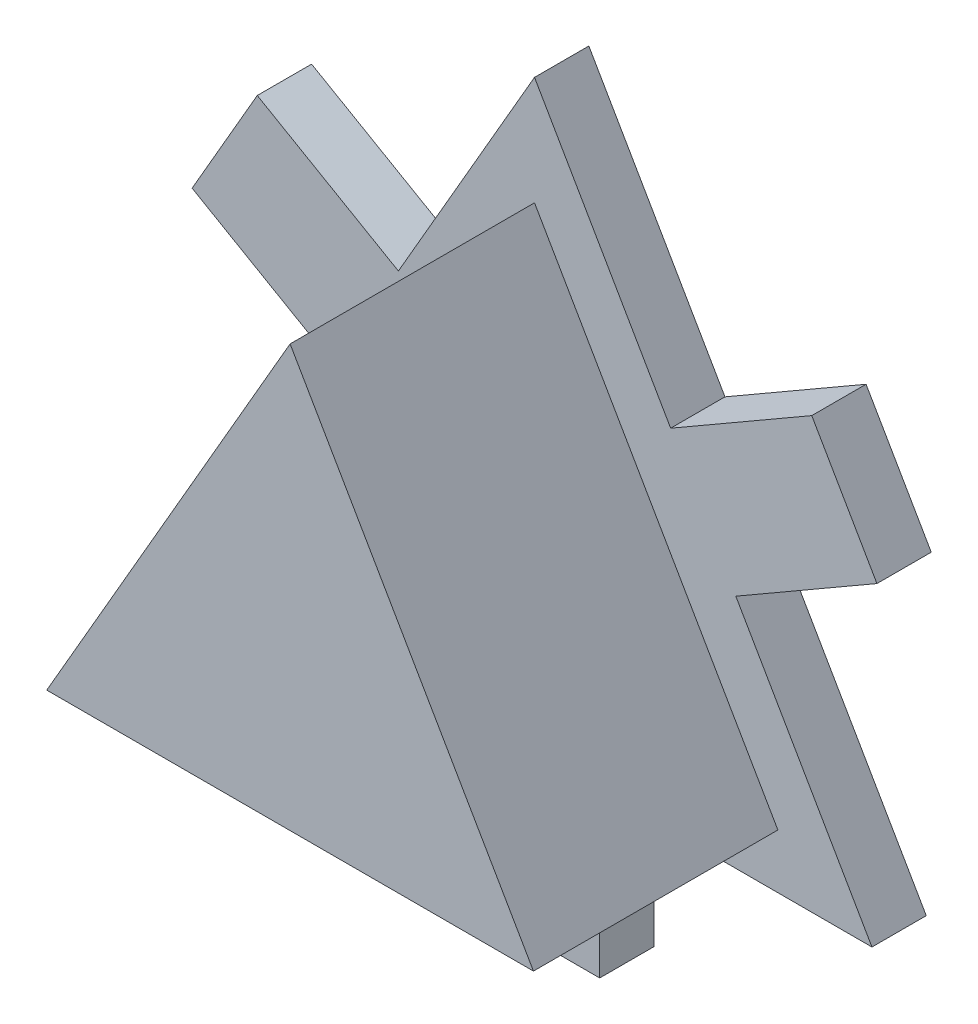
ISO-10303-21;
HEADER;
FILE_DESCRIPTION(('STEP AP214'),'2;1');
FILE_NAME('part.step','',(''),(''),'','','');
FILE_SCHEMA(('AUTOMOTIVE_DESIGN { 1 0 10303 214 1 1 1 1 }'));
ENDSEC;
DATA;
#1=APPLICATION_CONTEXT('core data for automotive mechanical design processes');
#2=APPLICATION_PROTOCOL_DEFINITION('international standard','automotive_design',2000,#1);
#3=PRODUCT_CONTEXT('',#1,'mechanical');
#4=PRODUCT('Part','Part','',(#3));
#5=PRODUCT_RELATED_PRODUCT_CATEGORY('part','',(#4));
#6=PRODUCT_DEFINITION_FORMATION('','',#4);
#7=PRODUCT_DEFINITION_CONTEXT('part definition',#1,'design');
#8=PRODUCT_DEFINITION('design','',#6,#7);
#9=PRODUCT_DEFINITION_SHAPE('','',#8);
#10=(LENGTH_UNIT() NAMED_UNIT(*) SI_UNIT(.MILLI.,.METRE.));
#11=(NAMED_UNIT(*) PLANE_ANGLE_UNIT() SI_UNIT($,.RADIAN.));
#12=(NAMED_UNIT(*) SI_UNIT($,.STERADIAN.) SOLID_ANGLE_UNIT());
#13=UNCERTAINTY_MEASURE_WITH_UNIT(LENGTH_MEASURE(1.E-05),#10,'distance_accuracy_value','');
#14=(GEOMETRIC_REPRESENTATION_CONTEXT(3) GLOBAL_UNCERTAINTY_ASSIGNED_CONTEXT((#13)) GLOBAL_UNIT_ASSIGNED_CONTEXT((#10,
#11,#12)) REPRESENTATION_CONTEXT('',''));
#15=CARTESIAN_POINT('',(0.,0.,0.));
#16=DIRECTION('',(0.,0.,1.));
#17=DIRECTION('',(1.,0.,0.));
#18=AXIS2_PLACEMENT_3D('',#15,#16,#17);
#19=CARTESIAN_POINT('',(8.51321397007544,6.26187833033706,4.5));
#20=DIRECTION('',(0.866025403784439,-0.5,0.));
#21=DIRECTION('',(0.5,0.866025403784439,0.));
#22=AXIS2_PLACEMENT_3D('',#19,#20,#21);
#23=PLANE('',#22);
#24=DIRECTION('',(-0.5,-0.866025403784439,0.));
#25=VECTOR('',#24,1.);
#26=CARTESIAN_POINT('',(8.51321397007544,6.26187833033706,0.));
#27=LINE('',#26,#25);
#28=CARTESIAN_POINT('',(8.51321397007544,6.26187833033706,0.));
#29=VERTEX_POINT('',#28);
#30=CARTESIAN_POINT('',(4.0328292123461,-1.49837570750732,0.));
#31=VERTEX_POINT('',#30);
#32=EDGE_CURVE('E180',#29,#31,#27,.T.);
#33=ORIENTED_EDGE('',*,*,#32,.T.);
#34=DIRECTION('',(0.,0.,-1.));
#35=VECTOR('',#34,1.);
#36=CARTESIAN_POINT('',(4.0328292123461,-1.49837570750732,4.5));
#37=LINE('',#36,#35);
#38=CARTESIAN_POINT('',(4.0328292123461,-1.49837570750732,4.5));
#39=VERTEX_POINT('',#38);
#40=EDGE_CURVE('E11',#39,#31,#37,.T.);
#41=ORIENTED_EDGE('',*,*,#40,.F.);
#42=DIRECTION('',(-0.5,-0.866025403784439,0.));
#43=VECTOR('',#42,1.);
#44=CARTESIAN_POINT('',(8.51321397007544,6.26187833033706,4.5));
#45=LINE('',#44,#43);
#46=CARTESIAN_POINT('',(8.51321397007544,6.26187833033706,4.5));
#47=VERTEX_POINT('',#46);
#48=EDGE_CURVE('E189',#47,#39,#45,.T.);
#49=ORIENTED_EDGE('',*,*,#48,.F.);
#50=DIRECTION('',(0.,0.,-1.));
#51=VECTOR('',#50,1.);
#52=CARTESIAN_POINT('',(8.51321397007544,6.26187833033706,4.5));
#53=LINE('',#52,#51);
#54=EDGE_CURVE('E194',#47,#29,#53,.T.);
#55=ORIENTED_EDGE('',*,*,#54,.T.);
#56=EDGE_LOOP('',(#33,#41,#49,#55));
#57=FACE_BOUND('',#56,.T.);
#58=ADVANCED_FACE('F35',(#57),#23,.F.);
#59=CARTESIAN_POINT('',(4.0328292123461,-1.49837570750732,4.5));
#60=DIRECTION('',(0.,1.,0.));
#61=DIRECTION('',(-1.,0.,0.));
#62=AXIS2_PLACEMENT_3D('',#59,#60,#61);
#63=PLANE('',#62);
#64=DIRECTION('',(1.,0.,0.));
#65=VECTOR('',#64,1.);
#66=CARTESIAN_POINT('',(4.0328292123461,-1.49837570750732,0.));
#67=LINE('',#66,#65);
#68=CARTESIAN_POINT('',(12.9935987278048,-1.49837570750732,0.));
#69=VERTEX_POINT('',#68);
#70=EDGE_CURVE('E183',#31,#69,#67,.T.);
#71=ORIENTED_EDGE('',*,*,#70,.T.);
#72=DIRECTION('',(0.,0.,-1.));
#73=VECTOR('',#72,1.);
#74=CARTESIAN_POINT('',(12.9935987278048,-1.49837570750732,4.5));
#75=LINE('',#74,#73);
#76=CARTESIAN_POINT('',(12.9935987278048,-1.49837570750732,4.5));
#77=VERTEX_POINT('',#76);
#78=EDGE_CURVE('E43',#77,#69,#75,.T.);
#79=ORIENTED_EDGE('',*,*,#78,.F.);
#80=DIRECTION('',(1.,0.,0.));
#81=VECTOR('',#80,1.);
#82=CARTESIAN_POINT('',(4.0328292123461,-1.49837570750732,4.5));
#83=LINE('',#82,#81);
#84=EDGE_CURVE('E191',#39,#77,#83,.T.);
#85=ORIENTED_EDGE('',*,*,#84,.F.);
#86=ORIENTED_EDGE('',*,*,#40,.T.);
#87=EDGE_LOOP('',(#71,#79,#85,#86));
#88=FACE_BOUND('',#87,.T.);
#89=ADVANCED_FACE('F206',(#88),#63,.F.);
#90=CARTESIAN_POINT('',(12.9935987278048,-1.49837570750732,4.5));
#91=DIRECTION('',(-0.866025403784438,-0.5,0.));
#92=DIRECTION('',(0.5,-0.866025403784439,0.));
#93=AXIS2_PLACEMENT_3D('',#90,#91,#92);
#94=PLANE('',#93);
#95=DIRECTION('',(-0.5,0.866025403784439,0.));
#96=VECTOR('',#95,1.);
#97=CARTESIAN_POINT('',(12.9935987278048,-1.49837570750732,0.));
#98=LINE('',#97,#96);
#99=EDGE_CURVE('E192',#69,#29,#98,.T.);
#100=ORIENTED_EDGE('',*,*,#99,.T.);
#101=ORIENTED_EDGE('',*,*,#54,.F.);
#102=DIRECTION('',(-0.5,0.866025403784439,0.));
#103=VECTOR('',#102,1.);
#104=CARTESIAN_POINT('',(12.9935987278048,-1.49837570750732,4.5));
#105=LINE('',#104,#103);
#106=EDGE_CURVE('E50',#77,#47,#105,.T.);
#107=ORIENTED_EDGE('',*,*,#106,.F.);
#108=ORIENTED_EDGE('',*,*,#78,.T.);
#109=EDGE_LOOP('',(#100,#101,#107,#108));
#110=FACE_BOUND('',#109,.T.);
#111=ADVANCED_FACE('F204',(#110),#94,.F.);
#112=CARTESIAN_POINT('',(0.,0.,4.5));
#113=DIRECTION('',(0.,0.,1.));
#114=DIRECTION('',(1.,0.,0.));
#115=AXIS2_PLACEMENT_3D('',#112,#113,#114);
#116=PLANE('',#115);
#117=ORIENTED_EDGE('',*,*,#48,.T.);
#118=ORIENTED_EDGE('',*,*,#84,.T.);
#119=ORIENTED_EDGE('',*,*,#106,.T.);
#120=EDGE_LOOP('',(#117,#118,#119));
#121=FACE_BOUND('',#120,.T.);
#122=ADVANCED_FACE('F213',(#121),#116,.T.);
#123=CARTESIAN_POINT('',(0.,0.,0.));
#124=DIRECTION('',(0.,0.,-1.));
#125=DIRECTION('',(-1.,0.,0.));
#126=AXIS2_PLACEMENT_3D('',#123,#124,#125);
#127=PLANE('',#126);
#128=DIRECTION('',(0.499999999999997,-0.86602540378444,0.));
#129=VECTOR('',#128,1.);
#130=CARTESIAN_POINT('',(13.6175079640779,5.42098179595619,0.));
#131=LINE('',#130,#129);
#132=CARTESIAN_POINT('',(13.6175079640779,5.42098179595619,0.));
#133=VERTEX_POINT('',#132);
#134=CARTESIAN_POINT('',(14.8175079640778,3.34252082687354,0.));
#135=VERTEX_POINT('',#134);
#136=EDGE_CURVE('E179',#133,#135,#131,.T.);
#137=ORIENTED_EDGE('',*,*,#136,.F.);
#138=DIRECTION('',(0.866025403784439,0.5,0.));
#139=VECTOR('',#138,1.);
#140=CARTESIAN_POINT('',(11.0194317527245,3.92098179595619,0.));
#141=LINE('',#140,#139);
#142=CARTESIAN_POINT('',(11.0194317527245,3.92098179595619,0.));
#143=VERTEX_POINT('',#142);
#144=EDGE_CURVE('E175',#143,#133,#141,.T.);
#145=ORIENTED_EDGE('',*,*,#144,.F.);
#146=DIRECTION('',(0.499999999999999,-0.866025403784439,0.));
#147=VECTOR('',#146,1.);
#148=CARTESIAN_POINT('',(8.51321397007544,8.26187833033706,0.));
#149=LINE('',#148,#147);
#150=CARTESIAN_POINT('',(8.51321397007544,8.26187833033706,0.));
#151=VERTEX_POINT('',#150);
#152=EDGE_CURVE('E404',#151,#143,#149,.T.);
#153=ORIENTED_EDGE('',*,*,#152,.F.);
#154=DIRECTION('',(0.5,0.866025403784438,0.));
#155=VECTOR('',#154,1.);
#156=CARTESIAN_POINT('',(6.00699618742632,3.92098179595619,0.));
#157=LINE('',#156,#155);
#158=CARTESIAN_POINT('',(6.00699618742632,3.92098179595619,0.));
#159=VERTEX_POINT('',#158);
#160=EDGE_CURVE('E434',#159,#151,#157,.T.);
#161=ORIENTED_EDGE('',*,*,#160,.F.);
#162=DIRECTION('',(0.866025403784437,-0.500000000000003,0.));
#163=VECTOR('',#162,1.);
#164=CARTESIAN_POINT('',(3.40891997607301,5.4209817959562,0.));
#165=LINE('',#164,#163);
#166=CARTESIAN_POINT('',(3.40891997607301,5.4209817959562,0.));
#167=VERTEX_POINT('',#166);
#168=EDGE_CURVE('E432',#167,#159,#165,.T.);
#169=ORIENTED_EDGE('',*,*,#168,.F.);
#170=DIRECTION('',(0.5,0.866025403784439,0.));
#171=VECTOR('',#170,1.);
#172=CARTESIAN_POINT('',(2.20891997607301,3.34252082687354,0.));
#173=LINE('',#172,#171);
#174=CARTESIAN_POINT('',(2.20891997607301,3.34252082687354,0.));
#175=VERTEX_POINT('',#174);
#176=EDGE_CURVE('E430',#175,#167,#173,.T.);
#177=ORIENTED_EDGE('',*,*,#176,.F.);
#178=DIRECTION('',(-0.866025403784439,0.5,0.));
#179=VECTOR('',#178,1.);
#180=CARTESIAN_POINT('',(4.80699618742633,1.84252082687354,0.));
#181=LINE('',#180,#179);
#182=CARTESIAN_POINT('',(4.80699618742633,1.84252082687354,0.));
#183=VERTEX_POINT('',#182);
#184=EDGE_CURVE('E428',#183,#175,#181,.T.);
#185=ORIENTED_EDGE('',*,*,#184,.F.);
#186=DIRECTION('',(0.5,0.866025403784439,0.));
#187=VECTOR('',#186,1.);
#188=CARTESIAN_POINT('',(2.30077840477722,-2.49837570750733,0.));
#189=LINE('',#188,#187);
#190=CARTESIAN_POINT('',(2.30077840477722,-2.49837570750733,0.));
#191=VERTEX_POINT('',#190);
#192=EDGE_CURVE('E426',#191,#183,#189,.T.);
#193=ORIENTED_EDGE('',*,*,#192,.F.);
#194=DIRECTION('',(-1.,0.,0.));
#195=VECTOR('',#194,1.);
#196=CARTESIAN_POINT('',(7.31321397007544,-2.49837570750733,0.));
#197=LINE('',#196,#195);
#198=CARTESIAN_POINT('',(7.31321397007544,-2.49837570750733,0.));
#199=VERTEX_POINT('',#198);
#200=EDGE_CURVE('E424',#199,#191,#197,.T.);
#201=ORIENTED_EDGE('',*,*,#200,.F.);
#202=DIRECTION('',(0.,1.,0.));
#203=VECTOR('',#202,1.);
#204=CARTESIAN_POINT('',(7.31321397007544,-5.49837570750732,0.));
#205=LINE('',#204,#203);
#206=CARTESIAN_POINT('',(7.31321397007544,-5.49837570750732,0.));
#207=VERTEX_POINT('',#206);
#208=EDGE_CURVE('E422',#207,#199,#205,.T.);
#209=ORIENTED_EDGE('',*,*,#208,.F.);
#210=DIRECTION('',(-1.,0.,0.));
#211=VECTOR('',#210,1.);
#212=CARTESIAN_POINT('',(9.71321397007543,-5.49837570750732,0.));
#213=LINE('',#212,#211);
#214=CARTESIAN_POINT('',(9.71321397007543,-5.49837570750732,0.));
#215=VERTEX_POINT('',#214);
#216=EDGE_CURVE('E420',#215,#207,#213,.T.);
#217=ORIENTED_EDGE('',*,*,#216,.F.);
#218=DIRECTION('',(0.,-1.,0.));
#219=VECTOR('',#218,1.);
#220=CARTESIAN_POINT('',(9.71321397007543,-2.49837570750733,0.));
#221=LINE('',#220,#219);
#222=CARTESIAN_POINT('',(9.71321397007543,-2.49837570750733,0.));
#223=VERTEX_POINT('',#222);
#224=EDGE_CURVE('E418',#223,#215,#221,.T.);
#225=ORIENTED_EDGE('',*,*,#224,.F.);
#226=DIRECTION('',(-1.,0.,0.));
#227=VECTOR('',#226,1.);
#228=CARTESIAN_POINT('',(14.7256495353737,-2.49837570750732,0.));
#229=LINE('',#228,#227);
#230=CARTESIAN_POINT('',(14.7256495353737,-2.49837570750732,0.));
#231=VERTEX_POINT('',#230);
#232=EDGE_CURVE('E416',#231,#223,#229,.T.);
#233=ORIENTED_EDGE('',*,*,#232,.F.);
#234=DIRECTION('',(0.500000000000001,-0.866025403784438,0.));
#235=VECTOR('',#234,1.);
#236=CARTESIAN_POINT('',(12.2194317527245,1.84252082687355,0.));
#237=LINE('',#236,#235);
#238=CARTESIAN_POINT('',(12.2194317527245,1.84252082687355,0.));
#239=VERTEX_POINT('',#238);
#240=EDGE_CURVE('E410',#239,#231,#237,.T.);
#241=ORIENTED_EDGE('',*,*,#240,.F.);
#242=DIRECTION('',(-0.866025403784438,-0.5,0.));
#243=VECTOR('',#242,1.);
#244=CARTESIAN_POINT('',(14.8175079640778,3.34252082687354,0.));
#245=LINE('',#244,#243);
#246=EDGE_CURVE('E408',#135,#239,#245,.T.);
#247=ORIENTED_EDGE('',*,*,#246,.F.);
#248=EDGE_LOOP('',(#137,#145,#153,#161,#169,#177,#185,#193,#201,#209,#217,#225,#233,#241,#247));
#249=FACE_BOUND('',#248,.T.);
#250=ORIENTED_EDGE('',*,*,#70,.F.);
#251=ORIENTED_EDGE('',*,*,#32,.F.);
#252=ORIENTED_EDGE('',*,*,#99,.F.);
#253=EDGE_LOOP('',(#250,#251,#252));
#254=FACE_BOUND('',#253,.T.);
#255=ADVANCED_FACE('F210',(#249,#254),#127,.F.);
#256=CARTESIAN_POINT('',(13.6175079640779,5.42098179595619,-1.));
#257=DIRECTION('',(-0.86602540378444,-0.499999999999997,0.));
#258=DIRECTION('',(0.499999999999997,-0.86602540378444,0.));
#259=AXIS2_PLACEMENT_3D('',#256,#257,#258);
#260=PLANE('',#259);
#261=ORIENTED_EDGE('',*,*,#136,.T.);
#262=DIRECTION('',(0.,0.,1.));
#263=VECTOR('',#262,1.);
#264=CARTESIAN_POINT('',(14.8175079640778,3.34252082687354,-1.));
#265=LINE('',#264,#263);
#266=CARTESIAN_POINT('',(14.8175079640778,3.34252082687354,-1.));
#267=VERTEX_POINT('',#266);
#268=EDGE_CURVE('E159',#267,#135,#265,.T.);
#269=ORIENTED_EDGE('',*,*,#268,.F.);
#270=DIRECTION('',(0.499999999999997,-0.86602540378444,0.));
#271=VECTOR('',#270,1.);
#272=CARTESIAN_POINT('',(13.6175079640779,5.42098179595619,-1.));
#273=LINE('',#272,#271);
#274=CARTESIAN_POINT('',(13.6175079640779,5.42098179595619,-1.));
#275=VERTEX_POINT('',#274);
#276=EDGE_CURVE('E166',#275,#267,#273,.T.);
#277=ORIENTED_EDGE('',*,*,#276,.F.);
#278=DIRECTION('',(0.,0.,1.));
#279=VECTOR('',#278,1.);
#280=CARTESIAN_POINT('',(13.6175079640779,5.42098179595619,-1.));
#281=LINE('',#280,#279);
#282=EDGE_CURVE('E400',#275,#133,#281,.T.);
#283=ORIENTED_EDGE('',*,*,#282,.T.);
#284=EDGE_LOOP('',(#261,#269,#277,#283));
#285=FACE_BOUND('',#284,.T.);
#286=ADVANCED_FACE('F177',(#285),#260,.F.);
#287=CARTESIAN_POINT('',(14.8175079640778,3.34252082687354,-1.));
#288=DIRECTION('',(-0.5,0.866025403784439,0.));
#289=DIRECTION('',(-0.866025403784439,-0.5,0.));
#290=AXIS2_PLACEMENT_3D('',#287,#288,#289);
#291=PLANE('',#290);
#292=ORIENTED_EDGE('',*,*,#246,.T.);
#293=DIRECTION('',(0.,0.,1.));
#294=VECTOR('',#293,1.);
#295=CARTESIAN_POINT('',(12.2194317527245,1.84252082687355,-1.));
#296=LINE('',#295,#294);
#297=CARTESIAN_POINT('',(12.2194317527245,1.84252082687355,-1.));
#298=VERTEX_POINT('',#297);
#299=EDGE_CURVE('E162',#298,#239,#296,.T.);
#300=ORIENTED_EDGE('',*,*,#299,.F.);
#301=DIRECTION('',(-0.866025403784438,-0.5,0.));
#302=VECTOR('',#301,1.);
#303=CARTESIAN_POINT('',(14.8175079640778,3.34252082687354,-1.));
#304=LINE('',#303,#302);
#305=EDGE_CURVE('E155',#267,#298,#304,.T.);
#306=ORIENTED_EDGE('',*,*,#305,.F.);
#307=ORIENTED_EDGE('',*,*,#268,.T.);
#308=EDGE_LOOP('',(#292,#300,#306,#307));
#309=FACE_BOUND('',#308,.T.);
#310=ADVANCED_FACE('F157',(#309),#291,.F.);
#311=CARTESIAN_POINT('',(12.2194317527245,1.84252082687355,-1.));
#312=DIRECTION('',(-0.866025403784438,-0.500000000000001,0.));
#313=DIRECTION('',(0.500000000000001,-0.866025403784438,0.));
#314=AXIS2_PLACEMENT_3D('',#311,#312,#313);
#315=PLANE('',#314);
#316=ORIENTED_EDGE('',*,*,#240,.T.);
#317=DIRECTION('',(0.,0.,1.));
#318=VECTOR('',#317,1.);
#319=CARTESIAN_POINT('',(14.7256495353737,-2.49837570750732,-1.));
#320=LINE('',#319,#318);
#321=CARTESIAN_POINT('',(14.7256495353737,-2.49837570750732,-1.));
#322=VERTEX_POINT('',#321);
#323=EDGE_CURVE('E185',#322,#231,#320,.T.);
#324=ORIENTED_EDGE('',*,*,#323,.F.);
#325=DIRECTION('',(0.500000000000001,-0.866025403784438,0.));
#326=VECTOR('',#325,1.);
#327=CARTESIAN_POINT('',(12.2194317527245,1.84252082687355,-1.));
#328=LINE('',#327,#326);
#329=EDGE_CURVE('E165',#298,#322,#328,.T.);
#330=ORIENTED_EDGE('',*,*,#329,.F.);
#331=ORIENTED_EDGE('',*,*,#299,.T.);
#332=EDGE_LOOP('',(#316,#324,#330,#331));
#333=FACE_BOUND('',#332,.T.);
#334=ADVANCED_FACE('F257',(#333),#315,.F.);
#335=CARTESIAN_POINT('',(14.7256495353737,-2.49837570750732,-1.));
#336=DIRECTION('',(0.,1.,0.));
#337=DIRECTION('',(-1.,0.,0.));
#338=AXIS2_PLACEMENT_3D('',#335,#336,#337);
#339=PLANE('',#338);
#340=ORIENTED_EDGE('',*,*,#232,.T.);
#341=DIRECTION('',(0.,0.,1.));
#342=VECTOR('',#341,1.);
#343=CARTESIAN_POINT('',(9.71321397007543,-2.49837570750733,-1.));
#344=LINE('',#343,#342);
#345=CARTESIAN_POINT('',(9.71321397007543,-2.49837570750733,-1.));
#346=VERTEX_POINT('',#345);
#347=EDGE_CURVE('E465',#346,#223,#344,.T.);
#348=ORIENTED_EDGE('',*,*,#347,.F.);
#349=DIRECTION('',(-1.,0.,0.));
#350=VECTOR('',#349,1.);
#351=CARTESIAN_POINT('',(14.7256495353737,-2.49837570750732,-1.));
#352=LINE('',#351,#350);
#353=EDGE_CURVE('E472',#322,#346,#352,.T.);
#354=ORIENTED_EDGE('',*,*,#353,.F.);
#355=ORIENTED_EDGE('',*,*,#323,.T.);
#356=EDGE_LOOP('',(#340,#348,#354,#355));
#357=FACE_BOUND('',#356,.T.);
#358=ADVANCED_FACE('F266',(#357),#339,.F.);
#359=CARTESIAN_POINT('',(9.71321397007543,-2.49837570750733,-1.));
#360=DIRECTION('',(-1.,0.,0.));
#361=DIRECTION('',(0.,0.,1.));
#362=AXIS2_PLACEMENT_3D('',#359,#360,#361);
#363=PLANE('',#362);
#364=ORIENTED_EDGE('',*,*,#224,.T.);
#365=DIRECTION('',(0.,0.,1.));
#366=VECTOR('',#365,1.);
#367=CARTESIAN_POINT('',(9.71321397007543,-5.49837570750732,-1.));
#368=LINE('',#367,#366);
#369=CARTESIAN_POINT('',(9.71321397007543,-5.49837570750732,-1.));
#370=VERTEX_POINT('',#369);
#371=EDGE_CURVE('E462',#370,#215,#368,.T.);
#372=ORIENTED_EDGE('',*,*,#371,.F.);
#373=DIRECTION('',(0.,-1.,0.));
#374=VECTOR('',#373,1.);
#375=CARTESIAN_POINT('',(9.71321397007543,-2.49837570750733,-1.));
#376=LINE('',#375,#374);
#377=EDGE_CURVE('E483',#346,#370,#376,.T.);
#378=ORIENTED_EDGE('',*,*,#377,.F.);
#379=ORIENTED_EDGE('',*,*,#347,.T.);
#380=EDGE_LOOP('',(#364,#372,#378,#379));
#381=FACE_BOUND('',#380,.T.);
#382=ADVANCED_FACE('F276',(#381),#363,.F.);
#383=CARTESIAN_POINT('',(9.71321397007543,-5.49837570750732,-1.));
#384=DIRECTION('',(0.,1.,0.));
#385=DIRECTION('',(0.,0.,1.));
#386=AXIS2_PLACEMENT_3D('',#383,#384,#385);
#387=PLANE('',#386);
#388=ORIENTED_EDGE('',*,*,#216,.T.);
#389=DIRECTION('',(0.,0.,1.));
#390=VECTOR('',#389,1.);
#391=CARTESIAN_POINT('',(7.31321397007544,-5.49837570750732,-1.));
#392=LINE('',#391,#390);
#393=CARTESIAN_POINT('',(7.31321397007544,-5.49837570750732,-1.));
#394=VERTEX_POINT('',#393);
#395=EDGE_CURVE('E459',#394,#207,#392,.T.);
#396=ORIENTED_EDGE('',*,*,#395,.F.);
#397=DIRECTION('',(-1.,0.,0.));
#398=VECTOR('',#397,1.);
#399=CARTESIAN_POINT('',(9.71321397007543,-5.49837570750732,-1.));
#400=LINE('',#399,#398);
#401=EDGE_CURVE('E480',#370,#394,#400,.T.);
#402=ORIENTED_EDGE('',*,*,#401,.F.);
#403=ORIENTED_EDGE('',*,*,#371,.T.);
#404=EDGE_LOOP('',(#388,#396,#402,#403));
#405=FACE_BOUND('',#404,.T.);
#406=ADVANCED_FACE('F286',(#405),#387,.F.);
#407=CARTESIAN_POINT('',(7.31321397007544,-5.49837570750732,-1.));
#408=DIRECTION('',(1.,0.,0.));
#409=DIRECTION('',(0.,0.,-1.));
#410=AXIS2_PLACEMENT_3D('',#407,#408,#409);
#411=PLANE('',#410);
#412=ORIENTED_EDGE('',*,*,#208,.T.);
#413=DIRECTION('',(0.,0.,1.));
#414=VECTOR('',#413,1.);
#415=CARTESIAN_POINT('',(7.31321397007544,-2.49837570750733,-1.));
#416=LINE('',#415,#414);
#417=CARTESIAN_POINT('',(7.31321397007544,-2.49837570750733,-1.));
#418=VERTEX_POINT('',#417);
#419=EDGE_CURVE('E456',#418,#199,#416,.T.);
#420=ORIENTED_EDGE('',*,*,#419,.F.);
#421=DIRECTION('',(0.,1.,0.));
#422=VECTOR('',#421,1.);
#423=CARTESIAN_POINT('',(7.31321397007544,-5.49837570750732,-1.));
#424=LINE('',#423,#422);
#425=EDGE_CURVE('E482',#394,#418,#424,.T.);
#426=ORIENTED_EDGE('',*,*,#425,.F.);
#427=ORIENTED_EDGE('',*,*,#395,.T.);
#428=EDGE_LOOP('',(#412,#420,#426,#427));
#429=FACE_BOUND('',#428,.T.);
#430=ADVANCED_FACE('F296',(#429),#411,.F.);
#431=CARTESIAN_POINT('',(7.31321397007544,-2.49837570750733,-1.));
#432=DIRECTION('',(0.,1.,0.));
#433=DIRECTION('',(0.,0.,1.));
#434=AXIS2_PLACEMENT_3D('',#431,#432,#433);
#435=PLANE('',#434);
#436=ORIENTED_EDGE('',*,*,#200,.T.);
#437=DIRECTION('',(0.,0.,1.));
#438=VECTOR('',#437,1.);
#439=CARTESIAN_POINT('',(2.30077840477722,-2.49837570750733,-1.));
#440=LINE('',#439,#438);
#441=CARTESIAN_POINT('',(2.30077840477722,-2.49837570750733,-1.));
#442=VERTEX_POINT('',#441);
#443=EDGE_CURVE('E453',#442,#191,#440,.T.);
#444=ORIENTED_EDGE('',*,*,#443,.F.);
#445=DIRECTION('',(-1.,0.,0.));
#446=VECTOR('',#445,1.);
#447=CARTESIAN_POINT('',(7.31321397007544,-2.49837570750733,-1.));
#448=LINE('',#447,#446);
#449=EDGE_CURVE('E485',#418,#442,#448,.T.);
#450=ORIENTED_EDGE('',*,*,#449,.F.);
#451=ORIENTED_EDGE('',*,*,#419,.T.);
#452=EDGE_LOOP('',(#436,#444,#450,#451));
#453=FACE_BOUND('',#452,.T.);
#454=ADVANCED_FACE('F306',(#453),#435,.F.);
#455=CARTESIAN_POINT('',(2.30077840477722,-2.49837570750733,-1.));
#456=DIRECTION('',(0.866025403784439,-0.5,0.));
#457=DIRECTION('',(0.5,0.866025403784439,0.));
#458=AXIS2_PLACEMENT_3D('',#455,#456,#457);
#459=PLANE('',#458);
#460=ORIENTED_EDGE('',*,*,#192,.T.);
#461=DIRECTION('',(0.,0.,1.));
#462=VECTOR('',#461,1.);
#463=CARTESIAN_POINT('',(4.80699618742633,1.84252082687354,-1.));
#464=LINE('',#463,#462);
#465=CARTESIAN_POINT('',(4.80699618742633,1.84252082687354,-1.));
#466=VERTEX_POINT('',#465);
#467=EDGE_CURVE('E450',#466,#183,#464,.T.);
#468=ORIENTED_EDGE('',*,*,#467,.F.);
#469=DIRECTION('',(0.5,0.866025403784439,0.));
#470=VECTOR('',#469,1.);
#471=CARTESIAN_POINT('',(2.30077840477722,-2.49837570750733,-1.));
#472=LINE('',#471,#470);
#473=EDGE_CURVE('E491',#442,#466,#472,.T.);
#474=ORIENTED_EDGE('',*,*,#473,.F.);
#475=ORIENTED_EDGE('',*,*,#443,.T.);
#476=EDGE_LOOP('',(#460,#468,#474,#475));
#477=FACE_BOUND('',#476,.T.);
#478=ADVANCED_FACE('F316',(#477),#459,.F.);
#479=CARTESIAN_POINT('',(4.80699618742633,1.84252082687354,-1.));
#480=DIRECTION('',(0.5,0.866025403784439,0.));
#481=DIRECTION('',(-0.866025403784439,0.5,0.));
#482=AXIS2_PLACEMENT_3D('',#479,#480,#481);
#483=PLANE('',#482);
#484=ORIENTED_EDGE('',*,*,#184,.T.);
#485=DIRECTION('',(0.,0.,1.));
#486=VECTOR('',#485,1.);
#487=CARTESIAN_POINT('',(2.20891997607301,3.34252082687354,-1.));
#488=LINE('',#487,#486);
#489=CARTESIAN_POINT('',(2.20891997607301,3.34252082687354,-1.));
#490=VERTEX_POINT('',#489);
#491=EDGE_CURVE('E447',#490,#175,#488,.T.);
#492=ORIENTED_EDGE('',*,*,#491,.F.);
#493=DIRECTION('',(-0.866025403784439,0.5,0.));
#494=VECTOR('',#493,1.);
#495=CARTESIAN_POINT('',(4.80699618742633,1.84252082687354,-1.));
#496=LINE('',#495,#494);
#497=EDGE_CURVE('E493',#466,#490,#496,.T.);
#498=ORIENTED_EDGE('',*,*,#497,.F.);
#499=ORIENTED_EDGE('',*,*,#467,.T.);
#500=EDGE_LOOP('',(#484,#492,#498,#499));
#501=FACE_BOUND('',#500,.T.);
#502=ADVANCED_FACE('F326',(#501),#483,.F.);
#503=CARTESIAN_POINT('',(2.20891997607301,3.34252082687354,-1.));
#504=DIRECTION('',(0.866025403784439,-0.5,0.));
#505=DIRECTION('',(0.5,0.866025403784439,0.));
#506=AXIS2_PLACEMENT_3D('',#503,#504,#505);
#507=PLANE('',#506);
#508=ORIENTED_EDGE('',*,*,#176,.T.);
#509=DIRECTION('',(0.,0.,1.));
#510=VECTOR('',#509,1.);
#511=CARTESIAN_POINT('',(3.40891997607301,5.4209817959562,-1.));
#512=LINE('',#511,#510);
#513=CARTESIAN_POINT('',(3.40891997607301,5.4209817959562,-1.));
#514=VERTEX_POINT('',#513);
#515=EDGE_CURVE('E444',#514,#167,#512,.T.);
#516=ORIENTED_EDGE('',*,*,#515,.F.);
#517=DIRECTION('',(0.5,0.866025403784439,0.));
#518=VECTOR('',#517,1.);
#519=CARTESIAN_POINT('',(2.20891997607301,3.34252082687354,-1.));
#520=LINE('',#519,#518);
#521=EDGE_CURVE('E495',#490,#514,#520,.T.);
#522=ORIENTED_EDGE('',*,*,#521,.F.);
#523=ORIENTED_EDGE('',*,*,#491,.T.);
#524=EDGE_LOOP('',(#508,#516,#522,#523));
#525=FACE_BOUND('',#524,.T.);
#526=ADVANCED_FACE('F336',(#525),#507,.F.);
#527=CARTESIAN_POINT('',(3.40891997607301,5.4209817959562,-1.));
#528=DIRECTION('',(-0.500000000000003,-0.866025403784437,0.));
#529=DIRECTION('',(0.866025403784437,-0.500000000000003,0.));
#530=AXIS2_PLACEMENT_3D('',#527,#528,#529);
#531=PLANE('',#530);
#532=ORIENTED_EDGE('',*,*,#168,.T.);
#533=DIRECTION('',(0.,0.,1.));
#534=VECTOR('',#533,1.);
#535=CARTESIAN_POINT('',(6.00699618742632,3.92098179595619,-1.));
#536=LINE('',#535,#534);
#537=CARTESIAN_POINT('',(6.00699618742632,3.92098179595619,-1.));
#538=VERTEX_POINT('',#537);
#539=EDGE_CURVE('E441',#538,#159,#536,.T.);
#540=ORIENTED_EDGE('',*,*,#539,.F.);
#541=DIRECTION('',(0.866025403784437,-0.500000000000003,0.));
#542=VECTOR('',#541,1.);
#543=CARTESIAN_POINT('',(3.40891997607301,5.4209817959562,-1.));
#544=LINE('',#543,#542);
#545=EDGE_CURVE('E497',#514,#538,#544,.T.);
#546=ORIENTED_EDGE('',*,*,#545,.F.);
#547=ORIENTED_EDGE('',*,*,#515,.T.);
#548=EDGE_LOOP('',(#532,#540,#546,#547));
#549=FACE_BOUND('',#548,.T.);
#550=ADVANCED_FACE('F346',(#549),#531,.F.);
#551=CARTESIAN_POINT('',(6.00699618742632,3.92098179595619,-1.));
#552=DIRECTION('',(0.866025403784439,-0.5,0.));
#553=DIRECTION('',(0.5,0.866025403784438,0.));
#554=AXIS2_PLACEMENT_3D('',#551,#552,#553);
#555=PLANE('',#554);
#556=ORIENTED_EDGE('',*,*,#160,.T.);
#557=DIRECTION('',(0.,0.,1.));
#558=VECTOR('',#557,1.);
#559=CARTESIAN_POINT('',(8.51321397007544,8.26187833033706,-1.));
#560=LINE('',#559,#558);
#561=CARTESIAN_POINT('',(8.51321397007544,8.26187833033706,-1.));
#562=VERTEX_POINT('',#561);
#563=EDGE_CURVE('E438',#562,#151,#560,.T.);
#564=ORIENTED_EDGE('',*,*,#563,.F.);
#565=DIRECTION('',(0.5,0.866025403784438,0.));
#566=VECTOR('',#565,1.);
#567=CARTESIAN_POINT('',(6.00699618742632,3.92098179595619,-1.));
#568=LINE('',#567,#566);
#569=EDGE_CURVE('E499',#538,#562,#568,.T.);
#570=ORIENTED_EDGE('',*,*,#569,.F.);
#571=ORIENTED_EDGE('',*,*,#539,.T.);
#572=EDGE_LOOP('',(#556,#564,#570,#571));
#573=FACE_BOUND('',#572,.T.);
#574=ADVANCED_FACE('F356',(#573),#555,.F.);
#575=CARTESIAN_POINT('',(8.51321397007544,8.26187833033706,-1.));
#576=DIRECTION('',(-0.866025403784439,-0.499999999999999,0.));
#577=DIRECTION('',(0.499999999999999,-0.866025403784439,0.));
#578=AXIS2_PLACEMENT_3D('',#575,#576,#577);
#579=PLANE('',#578);
#580=ORIENTED_EDGE('',*,*,#152,.T.);
#581=DIRECTION('',(0.,0.,1.));
#582=VECTOR('',#581,1.);
#583=CARTESIAN_POINT('',(11.0194317527245,3.92098179595619,-1.));
#584=LINE('',#583,#582);
#585=CARTESIAN_POINT('',(11.0194317527245,3.92098179595619,-1.));
#586=VERTEX_POINT('',#585);
#587=EDGE_CURVE('E402',#586,#143,#584,.T.);
#588=ORIENTED_EDGE('',*,*,#587,.F.);
#589=DIRECTION('',(0.499999999999999,-0.866025403784439,0.));
#590=VECTOR('',#589,1.);
#591=CARTESIAN_POINT('',(8.51321397007544,8.26187833033706,-1.));
#592=LINE('',#591,#590);
#593=EDGE_CURVE('E500',#562,#586,#592,.T.);
#594=ORIENTED_EDGE('',*,*,#593,.F.);
#595=ORIENTED_EDGE('',*,*,#563,.T.);
#596=EDGE_LOOP('',(#580,#588,#594,#595));
#597=FACE_BOUND('',#596,.T.);
#598=ADVANCED_FACE('F366',(#597),#579,.F.);
#599=CARTESIAN_POINT('',(11.0194317527245,3.92098179595619,-1.));
#600=DIRECTION('',(0.5,-0.866025403784439,0.));
#601=DIRECTION('',(0.866025403784439,0.5,0.));
#602=AXIS2_PLACEMENT_3D('',#599,#600,#601);
#603=PLANE('',#602);
#604=ORIENTED_EDGE('',*,*,#144,.T.);
#605=ORIENTED_EDGE('',*,*,#282,.F.);
#606=DIRECTION('',(0.866025403784439,0.5,0.));
#607=VECTOR('',#606,1.);
#608=CARTESIAN_POINT('',(11.0194317527245,3.92098179595619,-1.));
#609=LINE('',#608,#607);
#610=EDGE_CURVE('E171',#586,#275,#609,.T.);
#611=ORIENTED_EDGE('',*,*,#610,.F.);
#612=ORIENTED_EDGE('',*,*,#587,.T.);
#613=EDGE_LOOP('',(#604,#605,#611,#612));
#614=FACE_BOUND('',#613,.T.);
#615=ADVANCED_FACE('F376',(#614),#603,.F.);
#616=CARTESIAN_POINT('',(0.,0.,-1.));
#617=DIRECTION('',(0.,0.,-1.));
#618=DIRECTION('',(-1.,0.,0.));
#619=AXIS2_PLACEMENT_3D('',#616,#617,#618);
#620=PLANE('',#619);
#621=ORIENTED_EDGE('',*,*,#276,.T.);
#622=ORIENTED_EDGE('',*,*,#305,.T.);
#623=ORIENTED_EDGE('',*,*,#329,.T.);
#624=ORIENTED_EDGE('',*,*,#353,.T.);
#625=ORIENTED_EDGE('',*,*,#377,.T.);
#626=ORIENTED_EDGE('',*,*,#401,.T.);
#627=ORIENTED_EDGE('',*,*,#425,.T.);
#628=ORIENTED_EDGE('',*,*,#449,.T.);
#629=ORIENTED_EDGE('',*,*,#473,.T.);
#630=ORIENTED_EDGE('',*,*,#497,.T.);
#631=ORIENTED_EDGE('',*,*,#521,.T.);
#632=ORIENTED_EDGE('',*,*,#545,.T.);
#633=ORIENTED_EDGE('',*,*,#569,.T.);
#634=ORIENTED_EDGE('',*,*,#593,.T.);
#635=ORIENTED_EDGE('',*,*,#610,.T.);
#636=EDGE_LOOP('',(#621,#622,#623,#624,#625,#626,#627,#628,#629,#630,#631,#632,#633,#634,#635));
#637=FACE_BOUND('',#636,.T.);
#638=ADVANCED_FACE('F169',(#637),#620,.T.);
#639=CLOSED_SHELL('',(#58,#89,#111,#122,#255,#286,#310,#334,#358,#382,#406,#430,#454,#478,#502,
#526,#550,#574,#598,#615,#638));
#640=MANIFOLD_SOLID_BREP('B2',#639);
#641=ADVANCED_BREP_SHAPE_REPRESENTATION('',(#18,#640),#14);
#642=SHAPE_DEFINITION_REPRESENTATION(#9,#641);
ENDSEC;
END-ISO-10303-21;
